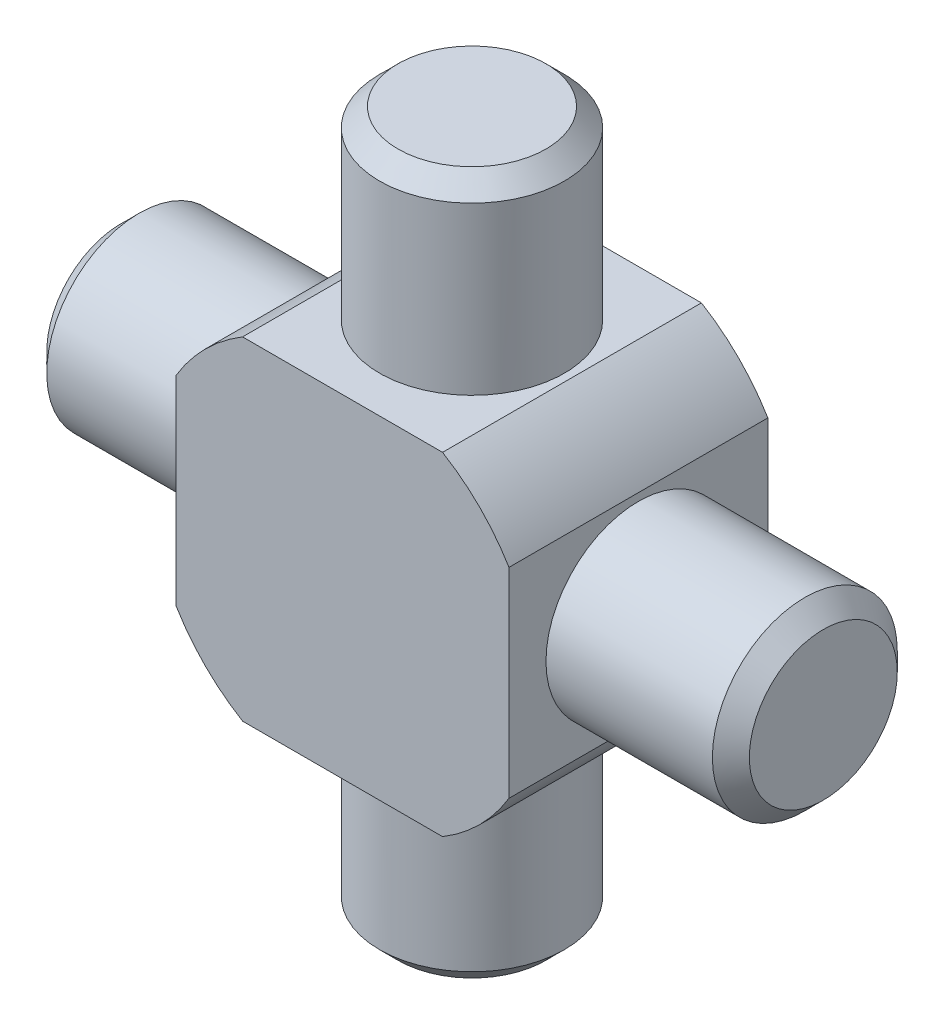
ISO-10303-21;
HEADER;
FILE_DESCRIPTION(('STEP AP214'),'2;1');
FILE_NAME('part.step','',(''),(''),'','','');
FILE_SCHEMA(('AUTOMOTIVE_DESIGN { 1 0 10303 214 1 1 1 1 }'));
ENDSEC;
DATA;
#1=APPLICATION_CONTEXT('core data for automotive mechanical design processes');
#2=APPLICATION_PROTOCOL_DEFINITION('international standard','automotive_design',2000,#1);
#3=PRODUCT_CONTEXT('',#1,'mechanical');
#4=PRODUCT('Part','Part','',(#3));
#5=PRODUCT_RELATED_PRODUCT_CATEGORY('part','',(#4));
#6=PRODUCT_DEFINITION_FORMATION('','',#4);
#7=PRODUCT_DEFINITION_CONTEXT('part definition',#1,'design');
#8=PRODUCT_DEFINITION('design','',#6,#7);
#9=PRODUCT_DEFINITION_SHAPE('','',#8);
#10=(LENGTH_UNIT() NAMED_UNIT(*) SI_UNIT(.MILLI.,.METRE.));
#11=(NAMED_UNIT(*) PLANE_ANGLE_UNIT() SI_UNIT($,.RADIAN.));
#12=(NAMED_UNIT(*) SI_UNIT($,.STERADIAN.) SOLID_ANGLE_UNIT());
#13=UNCERTAINTY_MEASURE_WITH_UNIT(LENGTH_MEASURE(1.E-05),#10,'distance_accuracy_value','');
#14=(GEOMETRIC_REPRESENTATION_CONTEXT(3) GLOBAL_UNCERTAINTY_ASSIGNED_CONTEXT((#13)) GLOBAL_UNIT_ASSIGNED_CONTEXT((#10,
#11,#12)) REPRESENTATION_CONTEXT('',''));
#15=CARTESIAN_POINT('',(0.,0.,0.));
#16=DIRECTION('',(0.,0.,1.));
#17=DIRECTION('',(1.,0.,0.));
#18=AXIS2_PLACEMENT_3D('',#15,#16,#17);
#19=CARTESIAN_POINT('',(-9.,5.40832691319599,7.));
#20=DIRECTION('',(1.,0.,0.));
#21=DIRECTION('',(0.,1.,0.));
#22=AXIS2_PLACEMENT_3D('',#19,#20,#21);
#23=PLANE('',#22);
#24=DIRECTION('',(0.,0.,-1.));
#25=VECTOR('',#24,1.);
#26=CARTESIAN_POINT('',(-9.,-5.40832691319598,7.));
#27=LINE('',#26,#25);
#28=CARTESIAN_POINT('',(-9.,-5.40832691319598,7.));
#29=VERTEX_POINT('',#28);
#30=CARTESIAN_POINT('',(-9.,-5.40832691319598,-7.));
#31=VERTEX_POINT('',#30);
#32=EDGE_CURVE('E167',#29,#31,#27,.T.);
#33=ORIENTED_EDGE('',*,*,#32,.F.);
#34=DIRECTION('',(0.,-1.,0.));
#35=VECTOR('',#34,1.);
#36=CARTESIAN_POINT('',(-9.,5.40832691319599,7.));
#37=LINE('',#36,#35);
#38=CARTESIAN_POINT('',(-9.,5.40832691319599,7.));
#39=VERTEX_POINT('',#38);
#40=EDGE_CURVE('E147',#39,#29,#37,.T.);
#41=ORIENTED_EDGE('',*,*,#40,.F.);
#42=DIRECTION('',(0.,0.,-1.));
#43=VECTOR('',#42,1.);
#44=CARTESIAN_POINT('',(-9.,5.40832691319599,7.));
#45=LINE('',#44,#43);
#46=CARTESIAN_POINT('',(-9.,5.40832691319599,-7.));
#47=VERTEX_POINT('',#46);
#48=EDGE_CURVE('E169',#39,#47,#45,.T.);
#49=ORIENTED_EDGE('',*,*,#48,.T.);
#50=DIRECTION('',(0.,-1.,0.));
#51=VECTOR('',#50,1.);
#52=CARTESIAN_POINT('',(-9.,5.40832691319599,-7.));
#53=LINE('',#52,#51);
#54=EDGE_CURVE('E125',#47,#31,#53,.T.);
#55=ORIENTED_EDGE('',*,*,#54,.T.);
#56=EDGE_LOOP('',(#33,#41,#49,#55));
#57=FACE_BOUND('',#56,.T.);
#58=CARTESIAN_POINT('',(-9.,0.,0.));
#59=DIRECTION('',(1.,0.,0.));
#60=DIRECTION('',(0.,1.,0.));
#61=AXIS2_PLACEMENT_3D('',#58,#59,#60);
#62=CIRCLE('',#61,5.);
#63=CARTESIAN_POINT('',(-9.,5.,0.));
#64=VERTEX_POINT('',#63);
#65=EDGE_CURVE('E177',#64,#64,#62,.F.);
#66=ORIENTED_EDGE('',*,*,#65,.F.);
#67=EDGE_LOOP('',(#66));
#68=FACE_BOUND('',#67,.T.);
#69=ADVANCED_FACE('F33',(#57,#68),#23,.F.);
#70=CARTESIAN_POINT('',(9.,-5.40832691319599,7.));
#71=DIRECTION('',(-1.,0.,0.));
#72=DIRECTION('',(0.,0.,1.));
#73=AXIS2_PLACEMENT_3D('',#70,#71,#72);
#74=PLANE('',#73);
#75=DIRECTION('',(0.,1.,0.));
#76=VECTOR('',#75,1.);
#77=CARTESIAN_POINT('',(9.,-5.40832691319599,7.));
#78=LINE('',#77,#76);
#79=CARTESIAN_POINT('',(9.,-5.40832691319599,7.));
#80=VERTEX_POINT('',#79);
#81=CARTESIAN_POINT('',(9.,5.40832691319599,7.));
#82=VERTEX_POINT('',#81);
#83=EDGE_CURVE('E158',#80,#82,#78,.T.);
#84=ORIENTED_EDGE('',*,*,#83,.F.);
#85=DIRECTION('',(0.,0.,-1.));
#86=VECTOR('',#85,1.);
#87=CARTESIAN_POINT('',(9.,-5.40832691319599,7.));
#88=LINE('',#87,#86);
#89=CARTESIAN_POINT('',(9.,-5.40832691319599,-7.));
#90=VERTEX_POINT('',#89);
#91=EDGE_CURVE('E56',#80,#90,#88,.T.);
#92=ORIENTED_EDGE('',*,*,#91,.T.);
#93=DIRECTION('',(0.,1.,0.));
#94=VECTOR('',#93,1.);
#95=CARTESIAN_POINT('',(9.,-5.40832691319599,-7.));
#96=LINE('',#95,#94);
#97=CARTESIAN_POINT('',(9.,5.40832691319599,-7.));
#98=VERTEX_POINT('',#97);
#99=EDGE_CURVE('E139',#90,#98,#96,.T.);
#100=ORIENTED_EDGE('',*,*,#99,.T.);
#101=DIRECTION('',(0.,0.,-1.));
#102=VECTOR('',#101,1.);
#103=CARTESIAN_POINT('',(9.,5.40832691319599,7.));
#104=LINE('',#103,#102);
#105=EDGE_CURVE('E48',#82,#98,#104,.T.);
#106=ORIENTED_EDGE('',*,*,#105,.F.);
#107=EDGE_LOOP('',(#84,#92,#100,#106));
#108=FACE_BOUND('',#107,.T.);
#109=CARTESIAN_POINT('',(9.,0.,0.));
#110=DIRECTION('',(-1.,0.,0.));
#111=DIRECTION('',(0.,0.,1.));
#112=AXIS2_PLACEMENT_3D('',#109,#110,#111);
#113=CIRCLE('',#112,5.);
#114=CARTESIAN_POINT('',(9.,0.,5.));
#115=VERTEX_POINT('',#114);
#116=EDGE_CURVE('E110',#115,#115,#113,.F.);
#117=ORIENTED_EDGE('',*,*,#116,.F.);
#118=EDGE_LOOP('',(#117));
#119=FACE_BOUND('',#118,.T.);
#120=ADVANCED_FACE('F213',(#108,#119),#74,.F.);
#121=CARTESIAN_POINT('',(-5.40832691319598,9.,7.));
#122=DIRECTION('',(0.,1.,0.));
#123=DIRECTION('',(-1.,0.,0.));
#124=AXIS2_PLACEMENT_3D('',#121,#122,#123);
#125=PLANE('',#124);
#126=DIRECTION('',(0.,0.,-1.));
#127=VECTOR('',#126,1.);
#128=CARTESIAN_POINT('',(-5.40832691319598,9.,7.));
#129=LINE('',#128,#127);
#130=CARTESIAN_POINT('',(-5.40832691319598,9.,7.));
#131=VERTEX_POINT('',#130);
#132=CARTESIAN_POINT('',(-5.40832691319598,9.,-7.));
#133=VERTEX_POINT('',#132);
#134=EDGE_CURVE('E111',#131,#133,#129,.T.);
#135=ORIENTED_EDGE('',*,*,#134,.F.);
#136=DIRECTION('',(1.,0.,0.));
#137=VECTOR('',#136,1.);
#138=CARTESIAN_POINT('',(-5.40832691319598,9.,7.));
#139=LINE('',#138,#137);
#140=CARTESIAN_POINT('',(5.40832691319598,9.,7.));
#141=VERTEX_POINT('',#140);
#142=EDGE_CURVE('E107',#131,#141,#139,.T.);
#143=ORIENTED_EDGE('',*,*,#142,.T.);
#144=DIRECTION('',(0.,0.,-1.));
#145=VECTOR('',#144,1.);
#146=CARTESIAN_POINT('',(5.40832691319598,9.,7.));
#147=LINE('',#146,#145);
#148=CARTESIAN_POINT('',(5.40832691319598,9.,-7.));
#149=VERTEX_POINT('',#148);
#150=EDGE_CURVE('E100',#141,#149,#147,.T.);
#151=ORIENTED_EDGE('',*,*,#150,.T.);
#152=DIRECTION('',(1.,0.,0.));
#153=VECTOR('',#152,1.);
#154=CARTESIAN_POINT('',(-5.40832691319598,9.,-7.));
#155=LINE('',#154,#153);
#156=EDGE_CURVE('E104',#133,#149,#155,.T.);
#157=ORIENTED_EDGE('',*,*,#156,.F.);
#158=EDGE_LOOP('',(#135,#143,#151,#157));
#159=FACE_BOUND('',#158,.T.);
#160=CARTESIAN_POINT('',(0.,9.,0.));
#161=DIRECTION('',(0.,1.,0.));
#162=DIRECTION('',(-1.,0.,0.));
#163=AXIS2_PLACEMENT_3D('',#160,#161,#162);
#164=CIRCLE('',#163,5.);
#165=CARTESIAN_POINT('',(-5.,9.,0.));
#166=VERTEX_POINT('',#165);
#167=EDGE_CURVE('E118',#166,#166,#164,.F.);
#168=ORIENTED_EDGE('',*,*,#167,.T.);
#169=EDGE_LOOP('',(#168));
#170=FACE_BOUND('',#169,.T.);
#171=ADVANCED_FACE('F35',(#159,#170),#125,.T.);
#172=CARTESIAN_POINT('',(5.40832691319599,-9.,7.));
#173=DIRECTION('',(0.,-1.,0.));
#174=DIRECTION('',(0.,0.,-1.));
#175=AXIS2_PLACEMENT_3D('',#172,#173,#174);
#176=PLANE('',#175);
#177=DIRECTION('',(0.,0.,-1.));
#178=VECTOR('',#177,1.);
#179=CARTESIAN_POINT('',(5.40832691319598,-9.,7.));
#180=LINE('',#179,#178);
#181=CARTESIAN_POINT('',(5.40832691319598,-9.,7.));
#182=VERTEX_POINT('',#181);
#183=CARTESIAN_POINT('',(5.40832691319598,-9.,-7.));
#184=VERTEX_POINT('',#183);
#185=EDGE_CURVE('E163',#182,#184,#180,.T.);
#186=ORIENTED_EDGE('',*,*,#185,.F.);
#187=DIRECTION('',(-1.,0.,0.));
#188=VECTOR('',#187,1.);
#189=CARTESIAN_POINT('',(5.40832691319599,-9.,7.));
#190=LINE('',#189,#188);
#191=CARTESIAN_POINT('',(-5.40832691319598,-9.,7.));
#192=VERTEX_POINT('',#191);
#193=EDGE_CURVE('E153',#182,#192,#190,.T.);
#194=ORIENTED_EDGE('',*,*,#193,.T.);
#195=DIRECTION('',(0.,0.,-1.));
#196=VECTOR('',#195,1.);
#197=CARTESIAN_POINT('',(-5.40832691319598,-9.,7.));
#198=LINE('',#197,#196);
#199=CARTESIAN_POINT('',(-5.40832691319598,-9.,-7.));
#200=VERTEX_POINT('',#199);
#201=EDGE_CURVE('E165',#192,#200,#198,.T.);
#202=ORIENTED_EDGE('',*,*,#201,.T.);
#203=DIRECTION('',(-1.,0.,0.));
#204=VECTOR('',#203,1.);
#205=CARTESIAN_POINT('',(5.40832691319599,-9.,-7.));
#206=LINE('',#205,#204);
#207=EDGE_CURVE('E134',#184,#200,#206,.T.);
#208=ORIENTED_EDGE('',*,*,#207,.F.);
#209=EDGE_LOOP('',(#186,#194,#202,#208));
#210=FACE_BOUND('',#209,.T.);
#211=CARTESIAN_POINT('',(0.,-9.,0.));
#212=DIRECTION('',(0.,-1.,0.));
#213=DIRECTION('',(0.,0.,-1.));
#214=AXIS2_PLACEMENT_3D('',#211,#212,#213);
#215=CIRCLE('',#214,5.);
#216=CARTESIAN_POINT('',(0.,-9.,-5.));
#217=VERTEX_POINT('',#216);
#218=EDGE_CURVE('E172',#217,#217,#215,.F.);
#219=ORIENTED_EDGE('',*,*,#218,.T.);
#220=EDGE_LOOP('',(#219));
#221=FACE_BOUND('',#220,.T.);
#222=ADVANCED_FACE('F233',(#210,#221),#176,.T.);
#223=CARTESIAN_POINT('',(0.,0.,7.));
#224=DIRECTION('',(0.,0.,-1.));
#225=DIRECTION('',(-1.,0.,0.));
#226=AXIS2_PLACEMENT_3D('',#223,#224,#225);
#227=CYLINDRICAL_SURFACE('',#226,10.5);
#228=ORIENTED_EDGE('',*,*,#150,.F.);
#229=CARTESIAN_POINT('',(0.,0.,7.));
#230=DIRECTION('',(0.,0.,1.));
#231=DIRECTION('',(1.,0.,0.));
#232=AXIS2_PLACEMENT_3D('',#229,#230,#231);
#233=CIRCLE('',#232,10.5);
#234=EDGE_CURVE('E141',#82,#141,#233,.T.);
#235=ORIENTED_EDGE('',*,*,#234,.F.);
#236=ORIENTED_EDGE('',*,*,#105,.T.);
#237=CARTESIAN_POINT('',(0.,0.,-7.));
#238=DIRECTION('',(0.,0.,1.));
#239=DIRECTION('',(1.,0.,0.));
#240=AXIS2_PLACEMENT_3D('',#237,#238,#239);
#241=CIRCLE('',#240,10.5);
#242=EDGE_CURVE('E114',#98,#149,#241,.T.);
#243=ORIENTED_EDGE('',*,*,#242,.T.);
#244=EDGE_LOOP('',(#228,#235,#236,#243));
#245=FACE_BOUND('',#244,.T.);
#246=ADVANCED_FACE('F115',(#245),#227,.T.);
#247=CARTESIAN_POINT('',(0.,0.,7.));
#248=DIRECTION('',(0.,0.,-1.));
#249=DIRECTION('',(-1.,0.,0.));
#250=AXIS2_PLACEMENT_3D('',#247,#248,#249);
#251=CYLINDRICAL_SURFACE('',#250,10.5);
#252=ORIENTED_EDGE('',*,*,#48,.F.);
#253=CARTESIAN_POINT('',(0.,0.,7.));
#254=DIRECTION('',(0.,0.,1.));
#255=DIRECTION('',(1.,0.,0.));
#256=AXIS2_PLACEMENT_3D('',#253,#254,#255);
#257=CIRCLE('',#256,10.5);
#258=EDGE_CURVE('E144',#131,#39,#257,.T.);
#259=ORIENTED_EDGE('',*,*,#258,.F.);
#260=ORIENTED_EDGE('',*,*,#134,.T.);
#261=CARTESIAN_POINT('',(0.,0.,-7.));
#262=DIRECTION('',(0.,0.,1.));
#263=DIRECTION('',(1.,0.,0.));
#264=AXIS2_PLACEMENT_3D('',#261,#262,#263);
#265=CIRCLE('',#264,10.5);
#266=EDGE_CURVE('E123',#133,#47,#265,.T.);
#267=ORIENTED_EDGE('',*,*,#266,.T.);
#268=EDGE_LOOP('',(#252,#259,#260,#267));
#269=FACE_BOUND('',#268,.T.);
#270=ADVANCED_FACE('F224',(#269),#251,.T.);
#271=CARTESIAN_POINT('',(0.,0.,7.));
#272=DIRECTION('',(0.,0.,-1.));
#273=DIRECTION('',(-1.,0.,0.));
#274=AXIS2_PLACEMENT_3D('',#271,#272,#273);
#275=CYLINDRICAL_SURFACE('',#274,10.5);
#276=ORIENTED_EDGE('',*,*,#201,.F.);
#277=CARTESIAN_POINT('',(0.,0.,7.));
#278=DIRECTION('',(0.,0.,1.));
#279=DIRECTION('',(1.,0.,0.));
#280=AXIS2_PLACEMENT_3D('',#277,#278,#279);
#281=CIRCLE('',#280,10.5);
#282=EDGE_CURVE('E150',#29,#192,#281,.T.);
#283=ORIENTED_EDGE('',*,*,#282,.F.);
#284=ORIENTED_EDGE('',*,*,#32,.T.);
#285=CARTESIAN_POINT('',(0.,0.,-7.));
#286=DIRECTION('',(0.,0.,1.));
#287=DIRECTION('',(1.,0.,0.));
#288=AXIS2_PLACEMENT_3D('',#285,#286,#287);
#289=CIRCLE('',#288,10.5);
#290=EDGE_CURVE('E131',#31,#200,#289,.T.);
#291=ORIENTED_EDGE('',*,*,#290,.T.);
#292=EDGE_LOOP('',(#276,#283,#284,#291));
#293=FACE_BOUND('',#292,.T.);
#294=ADVANCED_FACE('F222',(#293),#275,.T.);
#295=CARTESIAN_POINT('',(0.,0.,7.));
#296=DIRECTION('',(0.,0.,-1.));
#297=DIRECTION('',(-1.,0.,0.));
#298=AXIS2_PLACEMENT_3D('',#295,#296,#297);
#299=CYLINDRICAL_SURFACE('',#298,10.5);
#300=ORIENTED_EDGE('',*,*,#91,.F.);
#301=CARTESIAN_POINT('',(0.,0.,7.));
#302=DIRECTION('',(0.,0.,1.));
#303=DIRECTION('',(1.,0.,0.));
#304=AXIS2_PLACEMENT_3D('',#301,#302,#303);
#305=CIRCLE('',#304,10.5);
#306=EDGE_CURVE('E156',#182,#80,#305,.T.);
#307=ORIENTED_EDGE('',*,*,#306,.F.);
#308=ORIENTED_EDGE('',*,*,#185,.T.);
#309=CARTESIAN_POINT('',(0.,0.,-7.));
#310=DIRECTION('',(0.,0.,1.));
#311=DIRECTION('',(1.,0.,0.));
#312=AXIS2_PLACEMENT_3D('',#309,#310,#311);
#313=CIRCLE('',#312,10.5);
#314=EDGE_CURVE('E137',#184,#90,#313,.T.);
#315=ORIENTED_EDGE('',*,*,#314,.T.);
#316=EDGE_LOOP('',(#300,#307,#308,#315));
#317=FACE_BOUND('',#316,.T.);
#318=ADVANCED_FACE('F231',(#317),#299,.T.);
#319=CARTESIAN_POINT('',(0.,0.,7.));
#320=DIRECTION('',(0.,0.,1.));
#321=DIRECTION('',(1.,0.,0.));
#322=AXIS2_PLACEMENT_3D('',#319,#320,#321);
#323=PLANE('',#322);
#324=ORIENTED_EDGE('',*,*,#234,.T.);
#325=ORIENTED_EDGE('',*,*,#142,.F.);
#326=ORIENTED_EDGE('',*,*,#258,.T.);
#327=ORIENTED_EDGE('',*,*,#40,.T.);
#328=ORIENTED_EDGE('',*,*,#282,.T.);
#329=ORIENTED_EDGE('',*,*,#193,.F.);
#330=ORIENTED_EDGE('',*,*,#306,.T.);
#331=ORIENTED_EDGE('',*,*,#83,.T.);
#332=EDGE_LOOP('',(#324,#325,#326,#327,#328,#329,#330,#331));
#333=FACE_BOUND('',#332,.T.);
#334=ADVANCED_FACE('F238',(#333),#323,.T.);
#335=CARTESIAN_POINT('',(0.,0.,-7.));
#336=DIRECTION('',(0.,0.,1.));
#337=DIRECTION('',(1.,0.,0.));
#338=AXIS2_PLACEMENT_3D('',#335,#336,#337);
#339=PLANE('',#338);
#340=ORIENTED_EDGE('',*,*,#242,.F.);
#341=ORIENTED_EDGE('',*,*,#99,.F.);
#342=ORIENTED_EDGE('',*,*,#314,.F.);
#343=ORIENTED_EDGE('',*,*,#207,.T.);
#344=ORIENTED_EDGE('',*,*,#290,.F.);
#345=ORIENTED_EDGE('',*,*,#54,.F.);
#346=ORIENTED_EDGE('',*,*,#266,.F.);
#347=ORIENTED_EDGE('',*,*,#156,.T.);
#348=EDGE_LOOP('',(#340,#341,#342,#343,#344,#345,#346,#347));
#349=FACE_BOUND('',#348,.T.);
#350=ADVANCED_FACE('F120',(#349),#339,.F.);
#351=CARTESIAN_POINT('',(0.,-19.,0.));
#352=DIRECTION('',(0.,1.,0.));
#353=DIRECTION('',(0.,0.,1.));
#354=AXIS2_PLACEMENT_3D('',#351,#352,#353);
#355=PLANE('',#354);
#356=CARTESIAN_POINT('',(0.,-19.,0.));
#357=DIRECTION('',(0.,1.,0.));
#358=DIRECTION('',(0.,0.,1.));
#359=AXIS2_PLACEMENT_3D('',#356,#357,#358);
#360=CIRCLE('',#359,3.99999999999999);
#361=CARTESIAN_POINT('',(0.,-19.,3.99999999999999));
#362=VERTEX_POINT('',#361);
#363=EDGE_CURVE('E187',#362,#362,#360,.F.);
#364=ORIENTED_EDGE('',*,*,#363,.T.);
#365=EDGE_LOOP('',(#364));
#366=FACE_BOUND('',#365,.T.);
#367=ADVANCED_FACE('F264',(#366),#355,.F.);
#368=CARTESIAN_POINT('',(0.,19.,0.));
#369=DIRECTION('',(0.,-1.,0.));
#370=DIRECTION('',(0.,0.,-1.));
#371=AXIS2_PLACEMENT_3D('',#368,#369,#370);
#372=CYLINDRICAL_SURFACE('',#371,5.);
#373=CARTESIAN_POINT('',(0.,-18.,0.));
#374=DIRECTION('',(0.,1.,0.));
#375=DIRECTION('',(0.,0.,1.));
#376=AXIS2_PLACEMENT_3D('',#373,#374,#375);
#377=CIRCLE('',#376,5.);
#378=CARTESIAN_POINT('',(0.,-18.,5.));
#379=VERTEX_POINT('',#378);
#380=EDGE_CURVE('E184',#379,#379,#377,.T.);
#381=ORIENTED_EDGE('',*,*,#380,.T.);
#382=EDGE_LOOP('',(#381));
#383=FACE_BOUND('',#382,.T.);
#384=ORIENTED_EDGE('',*,*,#218,.F.);
#385=EDGE_LOOP('',(#384));
#386=FACE_BOUND('',#385,.T.);
#387=ADVANCED_FACE('F267',(#383,#386),#372,.T.);
#388=CARTESIAN_POINT('',(0.,18.,0.));
#389=DIRECTION('',(0.,1.,0.));
#390=DIRECTION('',(0.,0.,1.));
#391=AXIS2_PLACEMENT_3D('',#388,#389,#390);
#392=CIRCLE('',#391,5.);
#393=CARTESIAN_POINT('',(0.,18.,5.));
#394=VERTEX_POINT('',#393);
#395=EDGE_CURVE('E193',#394,#394,#392,.F.);
#396=ORIENTED_EDGE('',*,*,#395,.T.);
#397=EDGE_LOOP('',(#396));
#398=FACE_BOUND('',#397,.T.);
#399=ORIENTED_EDGE('',*,*,#167,.F.);
#400=EDGE_LOOP('',(#399));
#401=FACE_BOUND('',#400,.T.);
#402=ADVANCED_FACE('F271',(#398,#401),#372,.T.);
#403=CARTESIAN_POINT('',(0.,19.,0.));
#404=DIRECTION('',(0.,1.,0.));
#405=DIRECTION('',(0.,0.,1.));
#406=AXIS2_PLACEMENT_3D('',#403,#404,#405);
#407=PLANE('',#406);
#408=CARTESIAN_POINT('',(0.,19.,0.));
#409=DIRECTION('',(0.,1.,0.));
#410=DIRECTION('',(0.,0.,1.));
#411=AXIS2_PLACEMENT_3D('',#408,#409,#410);
#412=CIRCLE('',#411,3.99999999999998);
#413=CARTESIAN_POINT('',(0.,19.,3.99999999999998));
#414=VERTEX_POINT('',#413);
#415=EDGE_CURVE('E190',#414,#414,#412,.T.);
#416=ORIENTED_EDGE('',*,*,#415,.T.);
#417=EDGE_LOOP('',(#416));
#418=FACE_BOUND('',#417,.T.);
#419=ADVANCED_FACE('F260',(#418),#407,.T.);
#420=CARTESIAN_POINT('',(19.,0.,0.));
#421=DIRECTION('',(1.,0.,0.));
#422=DIRECTION('',(0.,0.,-1.));
#423=AXIS2_PLACEMENT_3D('',#420,#421,#422);
#424=PLANE('',#423);
#425=CARTESIAN_POINT('',(19.,0.,0.));
#426=DIRECTION('',(1.,0.,0.));
#427=DIRECTION('',(0.,0.,-1.));
#428=AXIS2_PLACEMENT_3D('',#425,#426,#427);
#429=CIRCLE('',#428,3.99999999999998);
#430=CARTESIAN_POINT('',(19.,0.,-3.99999999999998));
#431=VERTEX_POINT('',#430);
#432=EDGE_CURVE('E41',#431,#431,#429,.T.);
#433=ORIENTED_EDGE('',*,*,#432,.T.);
#434=EDGE_LOOP('',(#433));
#435=FACE_BOUND('',#434,.T.);
#436=ADVANCED_FACE('F198',(#435),#424,.T.);
#437=CARTESIAN_POINT('',(19.,0.,0.));
#438=DIRECTION('',(-1.,0.,0.));
#439=DIRECTION('',(0.,0.,1.));
#440=AXIS2_PLACEMENT_3D('',#437,#438,#439);
#441=CYLINDRICAL_SURFACE('',#440,5.);
#442=CARTESIAN_POINT('',(18.,0.,0.));
#443=DIRECTION('',(1.,0.,0.));
#444=DIRECTION('',(0.,0.,-1.));
#445=AXIS2_PLACEMENT_3D('',#442,#443,#444);
#446=CIRCLE('',#445,5.);
#447=CARTESIAN_POINT('',(18.,0.,-5.));
#448=VERTEX_POINT('',#447);
#449=EDGE_CURVE('E11',#448,#448,#446,.F.);
#450=ORIENTED_EDGE('',*,*,#449,.T.);
#451=EDGE_LOOP('',(#450));
#452=FACE_BOUND('',#451,.T.);
#453=ORIENTED_EDGE('',*,*,#116,.T.);
#454=EDGE_LOOP('',(#453));
#455=FACE_BOUND('',#454,.T.);
#456=ADVANCED_FACE('F249',(#452,#455),#441,.T.);
#457=CARTESIAN_POINT('',(-18.,0.,0.));
#458=DIRECTION('',(1.,0.,0.));
#459=DIRECTION('',(0.,0.,-1.));
#460=AXIS2_PLACEMENT_3D('',#457,#458,#459);
#461=CIRCLE('',#460,5.);
#462=CARTESIAN_POINT('',(-18.,0.,-5.));
#463=VERTEX_POINT('',#462);
#464=EDGE_CURVE('E178',#463,#463,#461,.T.);
#465=ORIENTED_EDGE('',*,*,#464,.T.);
#466=EDGE_LOOP('',(#465));
#467=FACE_BOUND('',#466,.T.);
#468=ORIENTED_EDGE('',*,*,#65,.T.);
#469=EDGE_LOOP('',(#468));
#470=FACE_BOUND('',#469,.T.);
#471=ADVANCED_FACE('F251',(#467,#470),#441,.T.);
#472=CARTESIAN_POINT('',(-19.,0.,0.));
#473=DIRECTION('',(1.,0.,0.));
#474=DIRECTION('',(0.,0.,-1.));
#475=AXIS2_PLACEMENT_3D('',#472,#473,#474);
#476=PLANE('',#475);
#477=CARTESIAN_POINT('',(-19.,0.,0.));
#478=DIRECTION('',(1.,0.,0.));
#479=DIRECTION('',(0.,0.,-1.));
#480=AXIS2_PLACEMENT_3D('',#477,#478,#479);
#481=CIRCLE('',#480,3.99999999999999);
#482=CARTESIAN_POINT('',(-19.,0.,-3.99999999999999));
#483=VERTEX_POINT('',#482);
#484=EDGE_CURVE('E181',#483,#483,#481,.F.);
#485=ORIENTED_EDGE('',*,*,#484,.T.);
#486=EDGE_LOOP('',(#485));
#487=FACE_BOUND('',#486,.T.);
#488=ADVANCED_FACE('F258',(#487),#476,.F.);
#489=CARTESIAN_POINT('',(-18.,0.,0.));
#490=DIRECTION('',(1.,0.,0.));
#491=DIRECTION('',(0.,0.,-1.));
#492=AXIS2_PLACEMENT_3D('',#489,#490,#491);
#493=CONICAL_SURFACE('',#492,5.,0.785398163397441);
#494=ORIENTED_EDGE('',*,*,#484,.F.);
#495=EDGE_LOOP('',(#494));
#496=FACE_BOUND('',#495,.T.);
#497=ORIENTED_EDGE('',*,*,#464,.F.);
#498=EDGE_LOOP('',(#497));
#499=FACE_BOUND('',#498,.T.);
#500=ADVANCED_FACE('F321',(#496,#499),#493,.T.);
#501=CARTESIAN_POINT('',(0.,-18.,0.));
#502=DIRECTION('',(0.,1.,0.));
#503=DIRECTION('',(0.,0.,1.));
#504=AXIS2_PLACEMENT_3D('',#501,#502,#503);
#505=CONICAL_SURFACE('',#504,5.,0.785398163397441);
#506=ORIENTED_EDGE('',*,*,#363,.F.);
#507=EDGE_LOOP('',(#506));
#508=FACE_BOUND('',#507,.T.);
#509=ORIENTED_EDGE('',*,*,#380,.F.);
#510=EDGE_LOOP('',(#509));
#511=FACE_BOUND('',#510,.T.);
#512=ADVANCED_FACE('F208',(#508,#511),#505,.T.);
#513=CARTESIAN_POINT('',(0.,19.,0.));
#514=DIRECTION('',(0.,-1.,0.));
#515=DIRECTION('',(0.,0.,-1.));
#516=AXIS2_PLACEMENT_3D('',#513,#514,#515);
#517=CONICAL_SURFACE('',#516,3.99999999999998,0.785398163397453);
#518=ORIENTED_EDGE('',*,*,#395,.F.);
#519=EDGE_LOOP('',(#518));
#520=FACE_BOUND('',#519,.T.);
#521=ORIENTED_EDGE('',*,*,#415,.F.);
#522=EDGE_LOOP('',(#521));
#523=FACE_BOUND('',#522,.T.);
#524=ADVANCED_FACE('F202',(#520,#523),#517,.T.);
#525=CARTESIAN_POINT('',(19.,0.,0.));
#526=DIRECTION('',(-1.,0.,0.));
#527=DIRECTION('',(0.,0.,1.));
#528=AXIS2_PLACEMENT_3D('',#525,#526,#527);
#529=CONICAL_SURFACE('',#528,3.99999999999998,0.785398163397453);
#530=ORIENTED_EDGE('',*,*,#449,.F.);
#531=EDGE_LOOP('',(#530));
#532=FACE_BOUND('',#531,.T.);
#533=ORIENTED_EDGE('',*,*,#432,.F.);
#534=EDGE_LOOP('',(#533));
#535=FACE_BOUND('',#534,.T.);
#536=ADVANCED_FACE('F200',(#532,#535),#529,.T.);
#537=CLOSED_SHELL('',(#69,#120,#171,#222,#246,#270,#294,#318,#334,#350,#367,#387,#402,#419,#436,
#456,#471,#488,#500,#512,#524,#536));
#538=MANIFOLD_SOLID_BREP('B2',#537);
#539=ADVANCED_BREP_SHAPE_REPRESENTATION('',(#18,#538),#14);
#540=SHAPE_DEFINITION_REPRESENTATION(#9,#539);
ENDSEC;
END-ISO-10303-21;
